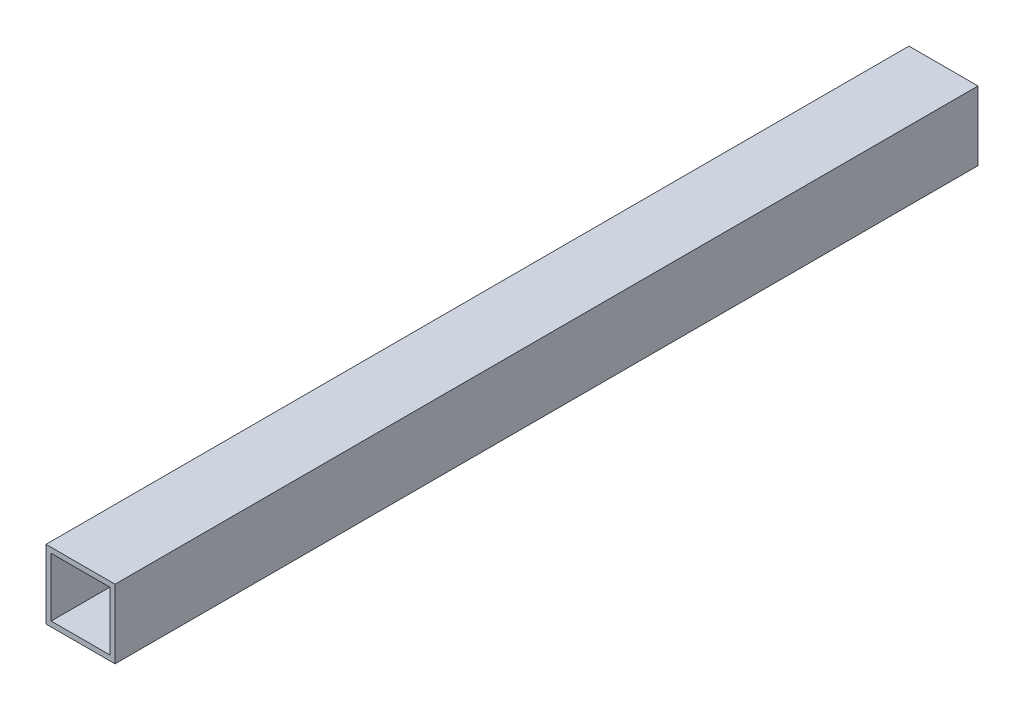
ISO-10303-21;
HEADER;
FILE_DESCRIPTION(('STEP AP214'),'2;1');
FILE_NAME('part.step','',(''),(''),'','','');
FILE_SCHEMA(('AUTOMOTIVE_DESIGN { 1 0 10303 214 1 1 1 1 }'));
ENDSEC;
DATA;
#1=APPLICATION_CONTEXT('core data for automotive mechanical design processes');
#2=APPLICATION_PROTOCOL_DEFINITION('international standard','automotive_design',2000,#1);
#3=PRODUCT_CONTEXT('',#1,'mechanical');
#4=PRODUCT('Part','Part','',(#3));
#5=PRODUCT_RELATED_PRODUCT_CATEGORY('part','',(#4));
#6=PRODUCT_DEFINITION_FORMATION('','',#4);
#7=PRODUCT_DEFINITION_CONTEXT('part definition',#1,'design');
#8=PRODUCT_DEFINITION('design','',#6,#7);
#9=PRODUCT_DEFINITION_SHAPE('','',#8);
#10=(LENGTH_UNIT() NAMED_UNIT(*) SI_UNIT(.MILLI.,.METRE.));
#11=(NAMED_UNIT(*) PLANE_ANGLE_UNIT() SI_UNIT($,.RADIAN.));
#12=(NAMED_UNIT(*) SI_UNIT($,.STERADIAN.) SOLID_ANGLE_UNIT());
#13=UNCERTAINTY_MEASURE_WITH_UNIT(LENGTH_MEASURE(1.E-05),#10,'distance_accuracy_value','');
#14=(GEOMETRIC_REPRESENTATION_CONTEXT(3) GLOBAL_UNCERTAINTY_ASSIGNED_CONTEXT((#13)) GLOBAL_UNIT_ASSIGNED_CONTEXT((#10,
#11,#12)) REPRESENTATION_CONTEXT('',''));
#15=CARTESIAN_POINT('',(0.,0.,0.));
#16=DIRECTION('',(0.,0.,1.));
#17=DIRECTION('',(1.,0.,0.));
#18=AXIS2_PLACEMENT_3D('',#15,#16,#17);
#19=CARTESIAN_POINT('',(0.,1.11022302462516E-13,250.));
#20=DIRECTION('',(0.,0.,1.));
#21=DIRECTION('',(1.,0.,0.));
#22=AXIS2_PLACEMENT_3D('',#19,#20,#21);
#23=PLANE('',#22);
#24=DIRECTION('',(0.,1.,0.));
#25=VECTOR('',#24,1.);
#26=CARTESIAN_POINT('',(9.99999999999998,10.0000000000001,250.));
#27=LINE('',#26,#25);
#28=CARTESIAN_POINT('',(10.0000000000001,-9.9999999999999,250.));
#29=VERTEX_POINT('',#28);
#30=CARTESIAN_POINT('',(9.99999999999998,10.0000000000001,250.));
#31=VERTEX_POINT('',#30);
#32=EDGE_CURVE('E136',#29,#31,#27,.T.);
#33=ORIENTED_EDGE('',*,*,#32,.T.);
#34=DIRECTION('',(-1.,0.,0.));
#35=VECTOR('',#34,1.);
#36=CARTESIAN_POINT('',(-10.0000000000001,10.,250.));
#37=LINE('',#36,#35);
#38=CARTESIAN_POINT('',(-10.0000000000001,10.,250.));
#39=VERTEX_POINT('',#38);
#40=EDGE_CURVE('E139',#31,#39,#37,.T.);
#41=ORIENTED_EDGE('',*,*,#40,.T.);
#42=DIRECTION('',(0.,-1.,0.));
#43=VECTOR('',#42,1.);
#44=CARTESIAN_POINT('',(-10.0000000000001,10.,250.));
#45=LINE('',#44,#43);
#46=CARTESIAN_POINT('',(-9.99999999999998,-10.,250.));
#47=VERTEX_POINT('',#46);
#48=EDGE_CURVE('E142',#39,#47,#45,.T.);
#49=ORIENTED_EDGE('',*,*,#48,.T.);
#50=DIRECTION('',(1.,0.,0.));
#51=VECTOR('',#50,1.);
#52=CARTESIAN_POINT('',(-9.99999999999998,-10.,250.));
#53=LINE('',#52,#51);
#54=EDGE_CURVE('E144',#47,#29,#53,.T.);
#55=ORIENTED_EDGE('',*,*,#54,.T.);
#56=EDGE_LOOP('',(#33,#41,#49,#55));
#57=FACE_BOUND('',#56,.T.);
#58=DIRECTION('',(1.,0.,0.));
#59=VECTOR('',#58,1.);
#60=CARTESIAN_POINT('',(-8.49999999999998,-8.49999999999987,250.));
#61=LINE('',#60,#59);
#62=CARTESIAN_POINT('',(-8.49999999999998,-8.49999999999987,250.));
#63=VERTEX_POINT('',#62);
#64=CARTESIAN_POINT('',(8.49999999999998,-8.4999999999999,250.));
#65=VERTEX_POINT('',#64);
#66=EDGE_CURVE('E108',#63,#65,#61,.T.);
#67=ORIENTED_EDGE('',*,*,#66,.F.);
#68=DIRECTION('',(0.,-1.,0.));
#69=VECTOR('',#68,1.);
#70=CARTESIAN_POINT('',(-8.50000000000001,8.50000000000004,250.));
#71=LINE('',#70,#69);
#72=CARTESIAN_POINT('',(-8.50000000000001,8.50000000000004,250.));
#73=VERTEX_POINT('',#72);
#74=EDGE_CURVE('E100',#73,#63,#71,.T.);
#75=ORIENTED_EDGE('',*,*,#74,.F.);
#76=DIRECTION('',(-1.,0.,0.));
#77=VECTOR('',#76,1.);
#78=CARTESIAN_POINT('',(-8.50000000000001,8.50000000000004,250.));
#79=LINE('',#78,#77);
#80=CARTESIAN_POINT('',(8.49999999999995,8.50000000000006,250.));
#81=VERTEX_POINT('',#80);
#82=EDGE_CURVE('E122',#81,#73,#79,.T.);
#83=ORIENTED_EDGE('',*,*,#82,.F.);
#84=DIRECTION('',(0.,1.,0.));
#85=VECTOR('',#84,1.);
#86=CARTESIAN_POINT('',(8.49999999999995,8.50000000000006,250.));
#87=LINE('',#86,#85);
#88=EDGE_CURVE('E120',#65,#81,#87,.T.);
#89=ORIENTED_EDGE('',*,*,#88,.F.);
#90=EDGE_LOOP('',(#67,#75,#83,#89));
#91=FACE_BOUND('',#90,.T.);
#92=ADVANCED_FACE('F35',(#57,#91),#23,.T.);
#93=CARTESIAN_POINT('',(0.,0.,0.));
#94=DIRECTION('',(0.,0.,1.));
#95=DIRECTION('',(1.,0.,0.));
#96=AXIS2_PLACEMENT_3D('',#93,#94,#95);
#97=PLANE('',#96);
#98=DIRECTION('',(0.,1.,0.));
#99=VECTOR('',#98,1.);
#100=CARTESIAN_POINT('',(9.99999999999998,10.,0.));
#101=LINE('',#100,#99);
#102=CARTESIAN_POINT('',(10.,-10.,0.));
#103=VERTEX_POINT('',#102);
#104=CARTESIAN_POINT('',(9.99999999999998,10.,0.));
#105=VERTEX_POINT('',#104);
#106=EDGE_CURVE('E116',#103,#105,#101,.T.);
#107=ORIENTED_EDGE('',*,*,#106,.F.);
#108=DIRECTION('',(1.,0.,0.));
#109=VECTOR('',#108,1.);
#110=CARTESIAN_POINT('',(-10.,-10.,0.));
#111=LINE('',#110,#109);
#112=CARTESIAN_POINT('',(-10.,-10.,0.));
#113=VERTEX_POINT('',#112);
#114=EDGE_CURVE('E140',#113,#103,#111,.T.);
#115=ORIENTED_EDGE('',*,*,#114,.F.);
#116=DIRECTION('',(0.,-1.,0.));
#117=VECTOR('',#116,1.);
#118=CARTESIAN_POINT('',(-10.0000000000001,9.99999999999999,0.));
#119=LINE('',#118,#117);
#120=CARTESIAN_POINT('',(-10.0000000000001,9.99999999999999,0.));
#121=VERTEX_POINT('',#120);
#122=EDGE_CURVE('E151',#121,#113,#119,.T.);
#123=ORIENTED_EDGE('',*,*,#122,.F.);
#124=DIRECTION('',(-1.,0.,0.));
#125=VECTOR('',#124,1.);
#126=CARTESIAN_POINT('',(-10.0000000000001,9.99999999999999,0.));
#127=LINE('',#126,#125);
#128=EDGE_CURVE('E149',#105,#121,#127,.T.);
#129=ORIENTED_EDGE('',*,*,#128,.F.);
#130=EDGE_LOOP('',(#107,#115,#123,#129));
#131=FACE_BOUND('',#130,.T.);
#132=DIRECTION('',(0.,-1.,0.));
#133=VECTOR('',#132,1.);
#134=CARTESIAN_POINT('',(-8.50000000000009,8.50000000000002,1.11022302462516E-13));
#135=LINE('',#134,#133);
#136=CARTESIAN_POINT('',(-8.50000000000009,8.50000000000002,1.11022302462516E-13));
#137=VERTEX_POINT('',#136);
#138=CARTESIAN_POINT('',(-8.50000000000012,-8.50000000000001,1.11022302462516E-13));
#139=VERTEX_POINT('',#138);
#140=EDGE_CURVE('E58',#137,#139,#135,.T.);
#141=ORIENTED_EDGE('',*,*,#140,.T.);
#142=DIRECTION('',(1.,0.,0.));
#143=VECTOR('',#142,1.);
#144=CARTESIAN_POINT('',(-8.50000000000012,-8.50000000000001,1.11022302462516E-13));
#145=LINE('',#144,#143);
#146=CARTESIAN_POINT('',(8.49999999999992,-8.49999999999995,0.));
#147=VERTEX_POINT('',#146);
#148=EDGE_CURVE('E115',#139,#147,#145,.T.);
#149=ORIENTED_EDGE('',*,*,#148,.T.);
#150=DIRECTION('',(0.,1.,0.));
#151=VECTOR('',#150,1.);
#152=CARTESIAN_POINT('',(8.49999999999987,8.50000000000006,0.));
#153=LINE('',#152,#151);
#154=CARTESIAN_POINT('',(8.49999999999987,8.50000000000006,0.));
#155=VERTEX_POINT('',#154);
#156=EDGE_CURVE('E128',#147,#155,#153,.T.);
#157=ORIENTED_EDGE('',*,*,#156,.T.);
#158=DIRECTION('',(-1.,0.,0.));
#159=VECTOR('',#158,1.);
#160=CARTESIAN_POINT('',(-8.50000000000009,8.50000000000002,1.11022302462516E-13));
#161=LINE('',#160,#159);
#162=EDGE_CURVE('E109',#155,#137,#161,.T.);
#163=ORIENTED_EDGE('',*,*,#162,.T.);
#164=EDGE_LOOP('',(#141,#149,#157,#163));
#165=FACE_BOUND('',#164,.T.);
#166=ADVANCED_FACE('F169',(#131,#165),#97,.F.);
#167=CARTESIAN_POINT('',(9.99999999999998,10.0000000000001,250.));
#168=DIRECTION('',(-1.,0.,0.));
#169=DIRECTION('',(0.,-1.,0.));
#170=AXIS2_PLACEMENT_3D('',#167,#168,#169);
#171=PLANE('',#170);
#172=ORIENTED_EDGE('',*,*,#106,.T.);
#173=DIRECTION('',(0.,0.,-1.));
#174=VECTOR('',#173,1.);
#175=CARTESIAN_POINT('',(9.99999999999998,10.0000000000001,250.));
#176=LINE('',#175,#174);
#177=EDGE_CURVE('E11',#31,#105,#176,.T.);
#178=ORIENTED_EDGE('',*,*,#177,.F.);
#179=ORIENTED_EDGE('',*,*,#32,.F.);
#180=DIRECTION('',(0.,0.,-1.));
#181=VECTOR('',#180,1.);
#182=CARTESIAN_POINT('',(10.0000000000001,-9.9999999999999,250.));
#183=LINE('',#182,#181);
#184=EDGE_CURVE('E146',#29,#103,#183,.T.);
#185=ORIENTED_EDGE('',*,*,#184,.T.);
#186=EDGE_LOOP('',(#172,#178,#179,#185));
#187=FACE_BOUND('',#186,.T.);
#188=ADVANCED_FACE('F37',(#187),#171,.F.);
#189=CARTESIAN_POINT('',(-10.0000000000001,10.,250.));
#190=DIRECTION('',(0.,-1.,0.));
#191=DIRECTION('',(0.,0.,-1.));
#192=AXIS2_PLACEMENT_3D('',#189,#190,#191);
#193=PLANE('',#192);
#194=ORIENTED_EDGE('',*,*,#128,.T.);
#195=DIRECTION('',(0.,0.,-1.));
#196=VECTOR('',#195,1.);
#197=CARTESIAN_POINT('',(-10.0000000000001,10.,250.));
#198=LINE('',#197,#196);
#199=EDGE_CURVE('E43',#39,#121,#198,.T.);
#200=ORIENTED_EDGE('',*,*,#199,.F.);
#201=ORIENTED_EDGE('',*,*,#40,.F.);
#202=ORIENTED_EDGE('',*,*,#177,.T.);
#203=EDGE_LOOP('',(#194,#200,#201,#202));
#204=FACE_BOUND('',#203,.T.);
#205=ADVANCED_FACE('F179',(#204),#193,.F.);
#206=CARTESIAN_POINT('',(-10.0000000000001,10.,250.));
#207=DIRECTION('',(1.,0.,0.));
#208=DIRECTION('',(0.,1.,0.));
#209=AXIS2_PLACEMENT_3D('',#206,#207,#208);
#210=PLANE('',#209);
#211=ORIENTED_EDGE('',*,*,#122,.T.);
#212=DIRECTION('',(0.,0.,-1.));
#213=VECTOR('',#212,1.);
#214=CARTESIAN_POINT('',(-9.99999999999998,-10.,250.));
#215=LINE('',#214,#213);
#216=EDGE_CURVE('E156',#47,#113,#215,.T.);
#217=ORIENTED_EDGE('',*,*,#216,.F.);
#218=ORIENTED_EDGE('',*,*,#48,.F.);
#219=ORIENTED_EDGE('',*,*,#199,.T.);
#220=EDGE_LOOP('',(#211,#217,#218,#219));
#221=FACE_BOUND('',#220,.T.);
#222=ADVANCED_FACE('F163',(#221),#210,.F.);
#223=CARTESIAN_POINT('',(-9.99999999999998,-10.,250.));
#224=DIRECTION('',(0.,1.,0.));
#225=DIRECTION('',(0.,0.,1.));
#226=AXIS2_PLACEMENT_3D('',#223,#224,#225);
#227=PLANE('',#226);
#228=ORIENTED_EDGE('',*,*,#114,.T.);
#229=ORIENTED_EDGE('',*,*,#184,.F.);
#230=ORIENTED_EDGE('',*,*,#54,.F.);
#231=ORIENTED_EDGE('',*,*,#216,.T.);
#232=EDGE_LOOP('',(#228,#229,#230,#231));
#233=FACE_BOUND('',#232,.T.);
#234=ADVANCED_FACE('F173',(#233),#227,.F.);
#235=CARTESIAN_POINT('',(-8.50000000000001,8.50000000000004,250.));
#236=DIRECTION('',(1.,0.,0.));
#237=DIRECTION('',(0.,0.,-1.));
#238=AXIS2_PLACEMENT_3D('',#235,#236,#237);
#239=PLANE('',#238);
#240=ORIENTED_EDGE('',*,*,#140,.F.);
#241=DIRECTION('',(0.,0.,-1.));
#242=VECTOR('',#241,1.);
#243=CARTESIAN_POINT('',(-8.50000000000001,8.50000000000004,250.));
#244=LINE('',#243,#242);
#245=EDGE_CURVE('E104',#73,#137,#244,.T.);
#246=ORIENTED_EDGE('',*,*,#245,.F.);
#247=ORIENTED_EDGE('',*,*,#74,.T.);
#248=DIRECTION('',(0.,0.,-1.));
#249=VECTOR('',#248,1.);
#250=CARTESIAN_POINT('',(-8.49999999999998,-8.49999999999987,250.));
#251=LINE('',#250,#249);
#252=EDGE_CURVE('E103',#63,#139,#251,.T.);
#253=ORIENTED_EDGE('',*,*,#252,.T.);
#254=EDGE_LOOP('',(#240,#246,#247,#253));
#255=FACE_BOUND('',#254,.T.);
#256=ADVANCED_FACE('F102',(#255),#239,.T.);
#257=CARTESIAN_POINT('',(-8.49999999999998,-8.49999999999987,250.));
#258=DIRECTION('',(0.,1.,0.));
#259=DIRECTION('',(-1.,0.,0.));
#260=AXIS2_PLACEMENT_3D('',#257,#258,#259);
#261=PLANE('',#260);
#262=ORIENTED_EDGE('',*,*,#148,.F.);
#263=ORIENTED_EDGE('',*,*,#252,.F.);
#264=ORIENTED_EDGE('',*,*,#66,.T.);
#265=DIRECTION('',(0.,0.,-1.));
#266=VECTOR('',#265,1.);
#267=CARTESIAN_POINT('',(8.49999999999998,-8.4999999999999,250.));
#268=LINE('',#267,#266);
#269=EDGE_CURVE('E117',#65,#147,#268,.T.);
#270=ORIENTED_EDGE('',*,*,#269,.T.);
#271=EDGE_LOOP('',(#262,#263,#264,#270));
#272=FACE_BOUND('',#271,.T.);
#273=ADVANCED_FACE('F112',(#272),#261,.T.);
#274=CARTESIAN_POINT('',(8.49999999999995,8.50000000000006,250.));
#275=DIRECTION('',(-1.,0.,0.));
#276=DIRECTION('',(0.,-1.,0.));
#277=AXIS2_PLACEMENT_3D('',#274,#275,#276);
#278=PLANE('',#277);
#279=ORIENTED_EDGE('',*,*,#156,.F.);
#280=ORIENTED_EDGE('',*,*,#269,.F.);
#281=ORIENTED_EDGE('',*,*,#88,.T.);
#282=DIRECTION('',(0.,0.,-1.));
#283=VECTOR('',#282,1.);
#284=CARTESIAN_POINT('',(8.49999999999995,8.50000000000006,250.));
#285=LINE('',#284,#283);
#286=EDGE_CURVE('E50',#81,#155,#285,.T.);
#287=ORIENTED_EDGE('',*,*,#286,.T.);
#288=EDGE_LOOP('',(#279,#280,#281,#287));
#289=FACE_BOUND('',#288,.T.);
#290=ADVANCED_FACE('F202',(#289),#278,.T.);
#291=CARTESIAN_POINT('',(-8.50000000000001,8.50000000000004,250.));
#292=DIRECTION('',(0.,-1.,0.));
#293=DIRECTION('',(0.,0.,-1.));
#294=AXIS2_PLACEMENT_3D('',#291,#292,#293);
#295=PLANE('',#294);
#296=ORIENTED_EDGE('',*,*,#162,.F.);
#297=ORIENTED_EDGE('',*,*,#286,.F.);
#298=ORIENTED_EDGE('',*,*,#82,.T.);
#299=ORIENTED_EDGE('',*,*,#245,.T.);
#300=EDGE_LOOP('',(#296,#297,#298,#299));
#301=FACE_BOUND('',#300,.T.);
#302=ADVANCED_FACE('F206',(#301),#295,.T.);
#303=CLOSED_SHELL('',(#92,#166,#188,#205,#222,#234,#256,#273,#290,#302));
#304=MANIFOLD_SOLID_BREP('B2',#303);
#305=ADVANCED_BREP_SHAPE_REPRESENTATION('',(#18,#304),#14);
#306=SHAPE_DEFINITION_REPRESENTATION(#9,#305);
ENDSEC;
END-ISO-10303-21;
